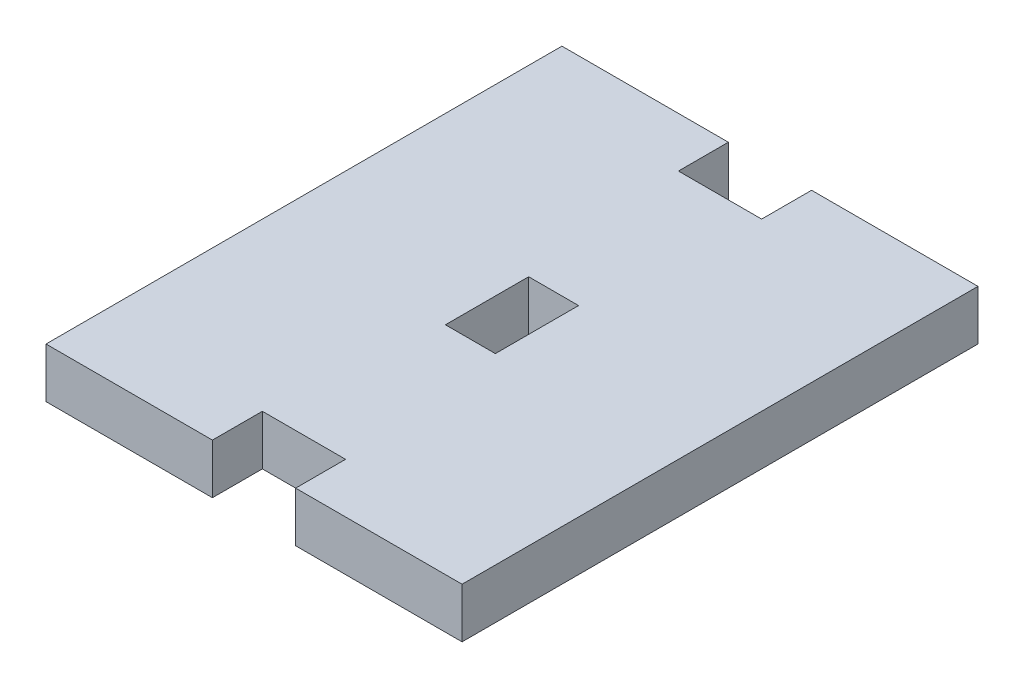
ISO-10303-21;
HEADER;
FILE_DESCRIPTION(('STEP AP214'),'2;1');
FILE_NAME('part.step','',(''),(''),'','','');
FILE_SCHEMA(('AUTOMOTIVE_DESIGN { 1 0 10303 214 1 1 1 1 }'));
ENDSEC;
DATA;
#1=APPLICATION_CONTEXT('core data for automotive mechanical design processes');
#2=APPLICATION_PROTOCOL_DEFINITION('international standard','automotive_design',2000,#1);
#3=PRODUCT_CONTEXT('',#1,'mechanical');
#4=PRODUCT('Part','Part','',(#3));
#5=PRODUCT_RELATED_PRODUCT_CATEGORY('part','',(#4));
#6=PRODUCT_DEFINITION_FORMATION('','',#4);
#7=PRODUCT_DEFINITION_CONTEXT('part definition',#1,'design');
#8=PRODUCT_DEFINITION('design','',#6,#7);
#9=PRODUCT_DEFINITION_SHAPE('','',#8);
#10=(LENGTH_UNIT() NAMED_UNIT(*) SI_UNIT(.MILLI.,.METRE.));
#11=(NAMED_UNIT(*) PLANE_ANGLE_UNIT() SI_UNIT($,.RADIAN.));
#12=(NAMED_UNIT(*) SI_UNIT($,.STERADIAN.) SOLID_ANGLE_UNIT());
#13=UNCERTAINTY_MEASURE_WITH_UNIT(LENGTH_MEASURE(1.E-05),#10,'distance_accuracy_value','');
#14=(GEOMETRIC_REPRESENTATION_CONTEXT(3) GLOBAL_UNCERTAINTY_ASSIGNED_CONTEXT((#13)) GLOBAL_UNIT_ASSIGNED_CONTEXT((#10,
#11,#12)) REPRESENTATION_CONTEXT('',''));
#15=CARTESIAN_POINT('',(0.,0.,0.));
#16=DIRECTION('',(0.,0.,1.));
#17=DIRECTION('',(1.,0.,0.));
#18=AXIS2_PLACEMENT_3D('',#15,#16,#17);
#19=CARTESIAN_POINT('',(25.,6.,-31.));
#20=DIRECTION('',(0.,0.,1.));
#21=DIRECTION('',(1.,0.,0.));
#22=AXIS2_PLACEMENT_3D('',#19,#20,#21);
#23=PLANE('',#22);
#24=DIRECTION('',(-1.,0.,0.));
#25=VECTOR('',#24,1.);
#26=CARTESIAN_POINT('',(25.,0.,-31.));
#27=LINE('',#26,#25);
#28=CARTESIAN_POINT('',(25.,0.,-31.));
#29=VERTEX_POINT('',#28);
#30=CARTESIAN_POINT('',(5.00000000000001,0.,-31.));
#31=VERTEX_POINT('',#30);
#32=EDGE_CURVE('E238',#29,#31,#27,.T.);
#33=ORIENTED_EDGE('',*,*,#32,.T.);
#34=DIRECTION('',(0.,-1.,0.));
#35=VECTOR('',#34,1.);
#36=CARTESIAN_POINT('',(5.00000000000001,6.,-31.));
#37=LINE('',#36,#35);
#38=CARTESIAN_POINT('',(5.00000000000001,6.,-31.));
#39=VERTEX_POINT('',#38);
#40=EDGE_CURVE('E180',#39,#31,#37,.T.);
#41=ORIENTED_EDGE('',*,*,#40,.F.);
#42=DIRECTION('',(-1.,0.,0.));
#43=VECTOR('',#42,1.);
#44=CARTESIAN_POINT('',(25.,6.,-31.));
#45=LINE('',#44,#43);
#46=CARTESIAN_POINT('',(25.,6.,-31.));
#47=VERTEX_POINT('',#46);
#48=EDGE_CURVE('E245',#47,#39,#45,.T.);
#49=ORIENTED_EDGE('',*,*,#48,.F.);
#50=DIRECTION('',(0.,-1.,0.));
#51=VECTOR('',#50,1.);
#52=CARTESIAN_POINT('',(25.,6.,-31.));
#53=LINE('',#52,#51);
#54=EDGE_CURVE('E262',#47,#29,#53,.T.);
#55=ORIENTED_EDGE('',*,*,#54,.T.);
#56=EDGE_LOOP('',(#33,#41,#49,#55));
#57=FACE_BOUND('',#56,.T.);
#58=ADVANCED_FACE('F34',(#57),#23,.F.);
#59=CARTESIAN_POINT('',(25.,6.,31.));
#60=DIRECTION('',(0.,0.,-1.));
#61=DIRECTION('',(-1.,0.,0.));
#62=AXIS2_PLACEMENT_3D('',#59,#60,#61);
#63=PLANE('',#62);
#64=DIRECTION('',(1.,0.,0.));
#65=VECTOR('',#64,1.);
#66=CARTESIAN_POINT('',(25.,0.,31.));
#67=LINE('',#66,#65);
#68=CARTESIAN_POINT('',(-25.,0.,31.));
#69=VERTEX_POINT('',#68);
#70=CARTESIAN_POINT('',(-4.99999999999999,0.,31.));
#71=VERTEX_POINT('',#70);
#72=EDGE_CURVE('E252',#69,#71,#67,.T.);
#73=ORIENTED_EDGE('',*,*,#72,.T.);
#74=DIRECTION('',(0.,-1.,0.));
#75=VECTOR('',#74,1.);
#76=CARTESIAN_POINT('',(-4.99999999999999,6.,31.));
#77=LINE('',#76,#75);
#78=CARTESIAN_POINT('',(-4.99999999999999,6.,31.));
#79=VERTEX_POINT('',#78);
#80=EDGE_CURVE('E201',#79,#71,#77,.T.);
#81=ORIENTED_EDGE('',*,*,#80,.F.);
#82=DIRECTION('',(1.,0.,0.));
#83=VECTOR('',#82,1.);
#84=CARTESIAN_POINT('',(25.,6.,31.));
#85=LINE('',#84,#83);
#86=CARTESIAN_POINT('',(-25.,6.,31.));
#87=VERTEX_POINT('',#86);
#88=EDGE_CURVE('E239',#87,#79,#85,.T.);
#89=ORIENTED_EDGE('',*,*,#88,.F.);
#90=DIRECTION('',(0.,-1.,0.));
#91=VECTOR('',#90,1.);
#92=CARTESIAN_POINT('',(-25.,6.,31.));
#93=LINE('',#92,#91);
#94=EDGE_CURVE('E11',#87,#69,#93,.T.);
#95=ORIENTED_EDGE('',*,*,#94,.T.);
#96=EDGE_LOOP('',(#73,#81,#89,#95));
#97=FACE_BOUND('',#96,.T.);
#98=ADVANCED_FACE('F299',(#97),#63,.F.);
#99=CARTESIAN_POINT('',(-25.,6.,31.));
#100=DIRECTION('',(1.,0.,0.));
#101=DIRECTION('',(0.,0.,-1.));
#102=AXIS2_PLACEMENT_3D('',#99,#100,#101);
#103=PLANE('',#102);
#104=DIRECTION('',(0.,0.,1.));
#105=VECTOR('',#104,1.);
#106=CARTESIAN_POINT('',(-25.,0.,31.));
#107=LINE('',#106,#105);
#108=CARTESIAN_POINT('',(-25.,0.,-31.));
#109=VERTEX_POINT('',#108);
#110=EDGE_CURVE('E226',#109,#69,#107,.T.);
#111=ORIENTED_EDGE('',*,*,#110,.T.);
#112=ORIENTED_EDGE('',*,*,#94,.F.);
#113=DIRECTION('',(0.,0.,1.));
#114=VECTOR('',#113,1.);
#115=CARTESIAN_POINT('',(-25.,6.,31.));
#116=LINE('',#115,#114);
#117=CARTESIAN_POINT('',(-25.,6.,-31.));
#118=VERTEX_POINT('',#117);
#119=EDGE_CURVE('E234',#118,#87,#116,.T.);
#120=ORIENTED_EDGE('',*,*,#119,.F.);
#121=DIRECTION('',(0.,-1.,0.));
#122=VECTOR('',#121,1.);
#123=CARTESIAN_POINT('',(-25.,6.,-31.));
#124=LINE('',#123,#122);
#125=EDGE_CURVE('E248',#118,#109,#124,.T.);
#126=ORIENTED_EDGE('',*,*,#125,.T.);
#127=EDGE_LOOP('',(#111,#112,#120,#126));
#128=FACE_BOUND('',#127,.T.);
#129=ADVANCED_FACE('F36',(#128),#103,.F.);
#130=CARTESIAN_POINT('',(5.00000000000001,6.,31.));
#131=VERTEX_POINT('',#130);
#132=CARTESIAN_POINT('',(25.,6.,31.));
#133=VERTEX_POINT('',#132);
#134=EDGE_CURVE('E237',#131,#133,#85,.T.);
#135=ORIENTED_EDGE('',*,*,#134,.F.);
#136=DIRECTION('',(0.,1.,0.));
#137=VECTOR('',#136,1.);
#138=CARTESIAN_POINT('',(5.00000000000001,6.,31.));
#139=LINE('',#138,#137);
#140=CARTESIAN_POINT('',(5.00000000000001,0.,31.));
#141=VERTEX_POINT('',#140);
#142=EDGE_CURVE('E212',#141,#131,#139,.T.);
#143=ORIENTED_EDGE('',*,*,#142,.F.);
#144=CARTESIAN_POINT('',(25.,0.,31.));
#145=VERTEX_POINT('',#144);
#146=EDGE_CURVE('E251',#141,#145,#67,.T.);
#147=ORIENTED_EDGE('',*,*,#146,.T.);
#148=DIRECTION('',(0.,-1.,0.));
#149=VECTOR('',#148,1.);
#150=CARTESIAN_POINT('',(25.,6.,31.));
#151=LINE('',#150,#149);
#152=EDGE_CURVE('E42',#133,#145,#151,.T.);
#153=ORIENTED_EDGE('',*,*,#152,.F.);
#154=EDGE_LOOP('',(#135,#143,#147,#153));
#155=FACE_BOUND('',#154,.T.);
#156=ADVANCED_FACE('F287',(#155),#63,.F.);
#157=CARTESIAN_POINT('',(25.,6.,31.));
#158=DIRECTION('',(-1.,0.,0.));
#159=DIRECTION('',(0.,0.,1.));
#160=AXIS2_PLACEMENT_3D('',#157,#158,#159);
#161=PLANE('',#160);
#162=DIRECTION('',(0.,0.,-1.));
#163=VECTOR('',#162,1.);
#164=CARTESIAN_POINT('',(25.,0.,31.));
#165=LINE('',#164,#163);
#166=EDGE_CURVE('E255',#145,#29,#165,.T.);
#167=ORIENTED_EDGE('',*,*,#166,.T.);
#168=ORIENTED_EDGE('',*,*,#54,.F.);
#169=DIRECTION('',(0.,0.,-1.));
#170=VECTOR('',#169,1.);
#171=CARTESIAN_POINT('',(25.,6.,31.));
#172=LINE('',#171,#170);
#173=EDGE_CURVE('E242',#133,#47,#172,.T.);
#174=ORIENTED_EDGE('',*,*,#173,.F.);
#175=ORIENTED_EDGE('',*,*,#152,.T.);
#176=EDGE_LOOP('',(#167,#168,#174,#175));
#177=FACE_BOUND('',#176,.T.);
#178=ADVANCED_FACE('F269',(#177),#161,.F.);
#179=CARTESIAN_POINT('',(-4.99999999999999,6.,-31.));
#180=VERTEX_POINT('',#179);
#181=EDGE_CURVE('E244',#180,#118,#45,.T.);
#182=ORIENTED_EDGE('',*,*,#181,.F.);
#183=DIRECTION('',(0.,1.,0.));
#184=VECTOR('',#183,1.);
#185=CARTESIAN_POINT('',(-4.99999999999999,6.,-31.));
#186=LINE('',#185,#184);
#187=CARTESIAN_POINT('',(-4.99999999999999,0.,-31.));
#188=VERTEX_POINT('',#187);
#189=EDGE_CURVE('E187',#188,#180,#186,.T.);
#190=ORIENTED_EDGE('',*,*,#189,.F.);
#191=EDGE_CURVE('E257',#188,#109,#27,.T.);
#192=ORIENTED_EDGE('',*,*,#191,.T.);
#193=ORIENTED_EDGE('',*,*,#125,.F.);
#194=EDGE_LOOP('',(#182,#190,#192,#193));
#195=FACE_BOUND('',#194,.T.);
#196=ADVANCED_FACE('F310',(#195),#23,.F.);
#197=CARTESIAN_POINT('',(0.,6.,0.));
#198=DIRECTION('',(0.,1.,0.));
#199=DIRECTION('',(0.,0.,1.));
#200=AXIS2_PLACEMENT_3D('',#197,#198,#199);
#201=PLANE('',#200);
#202=DIRECTION('',(0.,0.,1.));
#203=VECTOR('',#202,1.);
#204=CARTESIAN_POINT('',(-3.,6.,5.00000000000002));
#205=LINE('',#204,#203);
#206=CARTESIAN_POINT('',(-3.,6.,-4.99999999999999));
#207=VERTEX_POINT('',#206);
#208=CARTESIAN_POINT('',(-3.,6.,5.00000000000002));
#209=VERTEX_POINT('',#208);
#210=EDGE_CURVE('E49',#207,#209,#205,.T.);
#211=ORIENTED_EDGE('',*,*,#210,.F.);
#212=DIRECTION('',(-1.,0.,0.));
#213=VECTOR('',#212,1.);
#214=CARTESIAN_POINT('',(3.,6.,-4.99999999999999));
#215=LINE('',#214,#213);
#216=CARTESIAN_POINT('',(3.,6.,-4.99999999999999));
#217=VERTEX_POINT('',#216);
#218=EDGE_CURVE('E165',#217,#207,#215,.T.);
#219=ORIENTED_EDGE('',*,*,#218,.F.);
#220=DIRECTION('',(0.,0.,-1.));
#221=VECTOR('',#220,1.);
#222=CARTESIAN_POINT('',(3.,6.,5.00000000000002));
#223=LINE('',#222,#221);
#224=CARTESIAN_POINT('',(3.,6.,5.00000000000002));
#225=VERTEX_POINT('',#224);
#226=EDGE_CURVE('E168',#225,#217,#223,.T.);
#227=ORIENTED_EDGE('',*,*,#226,.F.);
#228=DIRECTION('',(1.,0.,0.));
#229=VECTOR('',#228,1.);
#230=CARTESIAN_POINT('',(3.,6.,5.00000000000002));
#231=LINE('',#230,#229);
#232=EDGE_CURVE('E174',#209,#225,#231,.T.);
#233=ORIENTED_EDGE('',*,*,#232,.F.);
#234=EDGE_LOOP('',(#211,#219,#227,#233));
#235=FACE_BOUND('',#234,.T.);
#236=DIRECTION('',(0.,0.,-1.));
#237=VECTOR('',#236,1.);
#238=CARTESIAN_POINT('',(5.00000000000001,6.,-25.));
#239=LINE('',#238,#237);
#240=CARTESIAN_POINT('',(5.00000000000001,6.,-25.));
#241=VERTEX_POINT('',#240);
#242=EDGE_CURVE('E199',#241,#39,#239,.T.);
#243=ORIENTED_EDGE('',*,*,#242,.F.);
#244=DIRECTION('',(1.,0.,0.));
#245=VECTOR('',#244,1.);
#246=CARTESIAN_POINT('',(5.00000000000001,6.,-25.));
#247=LINE('',#246,#245);
#248=CARTESIAN_POINT('',(-4.99999999999999,6.,-25.));
#249=VERTEX_POINT('',#248);
#250=EDGE_CURVE('E193',#249,#241,#247,.T.);
#251=ORIENTED_EDGE('',*,*,#250,.F.);
#252=DIRECTION('',(0.,0.,-1.));
#253=VECTOR('',#252,1.);
#254=CARTESIAN_POINT('',(-4.99999999999999,6.,-25.));
#255=LINE('',#254,#253);
#256=EDGE_CURVE('E202',#249,#180,#255,.T.);
#257=ORIENTED_EDGE('',*,*,#256,.T.);
#258=ORIENTED_EDGE('',*,*,#181,.T.);
#259=ORIENTED_EDGE('',*,*,#119,.T.);
#260=ORIENTED_EDGE('',*,*,#88,.T.);
#261=DIRECTION('',(0.,0.,1.));
#262=VECTOR('',#261,1.);
#263=CARTESIAN_POINT('',(-4.99999999999999,6.,25.));
#264=LINE('',#263,#262);
#265=CARTESIAN_POINT('',(-4.99999999999999,6.,25.));
#266=VERTEX_POINT('',#265);
#267=EDGE_CURVE('E224',#266,#79,#264,.T.);
#268=ORIENTED_EDGE('',*,*,#267,.F.);
#269=DIRECTION('',(-1.,0.,0.));
#270=VECTOR('',#269,1.);
#271=CARTESIAN_POINT('',(-4.99999999999999,6.,25.));
#272=LINE('',#271,#270);
#273=CARTESIAN_POINT('',(5.00000000000001,6.,25.));
#274=VERTEX_POINT('',#273);
#275=EDGE_CURVE('E218',#274,#266,#272,.T.);
#276=ORIENTED_EDGE('',*,*,#275,.F.);
#277=DIRECTION('',(0.,0.,1.));
#278=VECTOR('',#277,1.);
#279=CARTESIAN_POINT('',(5.00000000000001,6.,25.));
#280=LINE('',#279,#278);
#281=EDGE_CURVE('E227',#274,#131,#280,.T.);
#282=ORIENTED_EDGE('',*,*,#281,.T.);
#283=ORIENTED_EDGE('',*,*,#134,.T.);
#284=ORIENTED_EDGE('',*,*,#173,.T.);
#285=ORIENTED_EDGE('',*,*,#48,.T.);
#286=EDGE_LOOP('',(#243,#251,#257,#258,#259,#260,#268,#276,#282,#283,#284,#285));
#287=FACE_BOUND('',#286,.T.);
#288=ADVANCED_FACE('F283',(#235,#287),#201,.T.);
#289=CARTESIAN_POINT('',(0.,0.,0.));
#290=DIRECTION('',(0.,1.,0.));
#291=DIRECTION('',(0.,0.,1.));
#292=AXIS2_PLACEMENT_3D('',#289,#290,#291);
#293=PLANE('',#292);
#294=DIRECTION('',(-1.,0.,0.));
#295=VECTOR('',#294,1.);
#296=CARTESIAN_POINT('',(3.,0.,-4.99999999999999));
#297=LINE('',#296,#295);
#298=CARTESIAN_POINT('',(3.,0.,-4.99999999999999));
#299=VERTEX_POINT('',#298);
#300=CARTESIAN_POINT('',(-3.,0.,-4.99999999999999));
#301=VERTEX_POINT('',#300);
#302=EDGE_CURVE('E155',#299,#301,#297,.T.);
#303=ORIENTED_EDGE('',*,*,#302,.T.);
#304=DIRECTION('',(0.,0.,1.));
#305=VECTOR('',#304,1.);
#306=CARTESIAN_POINT('',(-3.,0.,5.00000000000002));
#307=LINE('',#306,#305);
#308=CARTESIAN_POINT('',(-3.,0.,5.00000000000002));
#309=VERTEX_POINT('',#308);
#310=EDGE_CURVE('E149',#301,#309,#307,.T.);
#311=ORIENTED_EDGE('',*,*,#310,.T.);
#312=DIRECTION('',(1.,0.,0.));
#313=VECTOR('',#312,1.);
#314=CARTESIAN_POINT('',(3.,0.,5.00000000000002));
#315=LINE('',#314,#313);
#316=CARTESIAN_POINT('',(3.,0.,5.00000000000002));
#317=VERTEX_POINT('',#316);
#318=EDGE_CURVE('E158',#309,#317,#315,.T.);
#319=ORIENTED_EDGE('',*,*,#318,.T.);
#320=DIRECTION('',(0.,0.,-1.));
#321=VECTOR('',#320,1.);
#322=CARTESIAN_POINT('',(3.,0.,5.00000000000002));
#323=LINE('',#322,#321);
#324=EDGE_CURVE('E57',#317,#299,#323,.T.);
#325=ORIENTED_EDGE('',*,*,#324,.T.);
#326=EDGE_LOOP('',(#303,#311,#319,#325));
#327=FACE_BOUND('',#326,.T.);
#328=DIRECTION('',(-1.,0.,0.));
#329=VECTOR('',#328,1.);
#330=CARTESIAN_POINT('',(5.00000000000001,0.,-25.));
#331=LINE('',#330,#329);
#332=CARTESIAN_POINT('',(5.00000000000001,0.,-25.));
#333=VERTEX_POINT('',#332);
#334=CARTESIAN_POINT('',(-4.99999999999999,0.,-25.));
#335=VERTEX_POINT('',#334);
#336=EDGE_CURVE('E186',#333,#335,#331,.T.);
#337=ORIENTED_EDGE('',*,*,#336,.F.);
#338=DIRECTION('',(0.,0.,-1.));
#339=VECTOR('',#338,1.);
#340=CARTESIAN_POINT('',(5.00000000000001,0.,-25.));
#341=LINE('',#340,#339);
#342=EDGE_CURVE('E196',#333,#31,#341,.T.);
#343=ORIENTED_EDGE('',*,*,#342,.T.);
#344=ORIENTED_EDGE('',*,*,#32,.F.);
#345=ORIENTED_EDGE('',*,*,#166,.F.);
#346=ORIENTED_EDGE('',*,*,#146,.F.);
#347=DIRECTION('',(0.,0.,1.));
#348=VECTOR('',#347,1.);
#349=CARTESIAN_POINT('',(5.00000000000001,0.,25.));
#350=LINE('',#349,#348);
#351=CARTESIAN_POINT('',(5.00000000000001,0.,25.));
#352=VERTEX_POINT('',#351);
#353=EDGE_CURVE('E230',#352,#141,#350,.T.);
#354=ORIENTED_EDGE('',*,*,#353,.F.);
#355=DIRECTION('',(1.,0.,0.));
#356=VECTOR('',#355,1.);
#357=CARTESIAN_POINT('',(-4.99999999999999,0.,25.));
#358=LINE('',#357,#356);
#359=CARTESIAN_POINT('',(-4.99999999999999,0.,25.));
#360=VERTEX_POINT('',#359);
#361=EDGE_CURVE('E211',#360,#352,#358,.T.);
#362=ORIENTED_EDGE('',*,*,#361,.F.);
#363=DIRECTION('',(0.,0.,1.));
#364=VECTOR('',#363,1.);
#365=CARTESIAN_POINT('',(-4.99999999999999,0.,25.));
#366=LINE('',#365,#364);
#367=EDGE_CURVE('E221',#360,#71,#366,.T.);
#368=ORIENTED_EDGE('',*,*,#367,.T.);
#369=ORIENTED_EDGE('',*,*,#72,.F.);
#370=ORIENTED_EDGE('',*,*,#110,.F.);
#371=ORIENTED_EDGE('',*,*,#191,.F.);
#372=DIRECTION('',(0.,0.,-1.));
#373=VECTOR('',#372,1.);
#374=CARTESIAN_POINT('',(-4.99999999999999,0.,-25.));
#375=LINE('',#374,#373);
#376=EDGE_CURVE('E205',#335,#188,#375,.T.);
#377=ORIENTED_EDGE('',*,*,#376,.F.);
#378=EDGE_LOOP('',(#337,#343,#344,#345,#346,#354,#362,#368,#369,#370,#371,#377));
#379=FACE_BOUND('',#378,.T.);
#380=ADVANCED_FACE('F162',(#327,#379),#293,.F.);
#381=CARTESIAN_POINT('',(-4.99999999999999,6.,25.));
#382=DIRECTION('',(-1.,0.,0.));
#383=DIRECTION('',(0.,-1.,0.));
#384=AXIS2_PLACEMENT_3D('',#381,#382,#383);
#385=PLANE('',#384);
#386=ORIENTED_EDGE('',*,*,#80,.T.);
#387=ORIENTED_EDGE('',*,*,#367,.F.);
#388=DIRECTION('',(0.,-1.,0.));
#389=VECTOR('',#388,1.);
#390=CARTESIAN_POINT('',(-4.99999999999999,6.,25.));
#391=LINE('',#390,#389);
#392=EDGE_CURVE('E209',#266,#360,#391,.T.);
#393=ORIENTED_EDGE('',*,*,#392,.F.);
#394=ORIENTED_EDGE('',*,*,#267,.T.);
#395=EDGE_LOOP('',(#386,#387,#393,#394));
#396=FACE_BOUND('',#395,.T.);
#397=ADVANCED_FACE('F296',(#396),#385,.F.);
#398=CARTESIAN_POINT('',(5.00000000000001,6.,25.));
#399=DIRECTION('',(1.,0.,0.));
#400=DIRECTION('',(0.,0.,-1.));
#401=AXIS2_PLACEMENT_3D('',#398,#399,#400);
#402=PLANE('',#401);
#403=ORIENTED_EDGE('',*,*,#142,.T.);
#404=ORIENTED_EDGE('',*,*,#281,.F.);
#405=DIRECTION('',(0.,1.,0.));
#406=VECTOR('',#405,1.);
#407=CARTESIAN_POINT('',(5.00000000000001,6.,25.));
#408=LINE('',#407,#406);
#409=EDGE_CURVE('E215',#352,#274,#408,.T.);
#410=ORIENTED_EDGE('',*,*,#409,.F.);
#411=ORIENTED_EDGE('',*,*,#353,.T.);
#412=EDGE_LOOP('',(#403,#404,#410,#411));
#413=FACE_BOUND('',#412,.T.);
#414=ADVANCED_FACE('F289',(#413),#402,.F.);
#415=CARTESIAN_POINT('',(0.,0.,25.));
#416=DIRECTION('',(0.,0.,1.));
#417=DIRECTION('',(1.,0.,0.));
#418=AXIS2_PLACEMENT_3D('',#415,#416,#417);
#419=PLANE('',#418);
#420=ORIENTED_EDGE('',*,*,#392,.T.);
#421=ORIENTED_EDGE('',*,*,#361,.T.);
#422=ORIENTED_EDGE('',*,*,#409,.T.);
#423=ORIENTED_EDGE('',*,*,#275,.T.);
#424=EDGE_LOOP('',(#420,#421,#422,#423));
#425=FACE_BOUND('',#424,.T.);
#426=ADVANCED_FACE('F293',(#425),#419,.T.);
#427=CARTESIAN_POINT('',(5.00000000000001,6.,-25.));
#428=DIRECTION('',(1.,0.,0.));
#429=DIRECTION('',(0.,1.,0.));
#430=AXIS2_PLACEMENT_3D('',#427,#428,#429);
#431=PLANE('',#430);
#432=ORIENTED_EDGE('',*,*,#40,.T.);
#433=ORIENTED_EDGE('',*,*,#342,.F.);
#434=DIRECTION('',(0.,-1.,0.));
#435=VECTOR('',#434,1.);
#436=CARTESIAN_POINT('',(5.00000000000001,6.,-25.));
#437=LINE('',#436,#435);
#438=EDGE_CURVE('E184',#241,#333,#437,.T.);
#439=ORIENTED_EDGE('',*,*,#438,.F.);
#440=ORIENTED_EDGE('',*,*,#242,.T.);
#441=EDGE_LOOP('',(#432,#433,#439,#440));
#442=FACE_BOUND('',#441,.T.);
#443=ADVANCED_FACE('F316',(#442),#431,.F.);
#444=CARTESIAN_POINT('',(-4.99999999999999,6.,-25.));
#445=DIRECTION('',(-1.,0.,0.));
#446=DIRECTION('',(0.,0.,1.));
#447=AXIS2_PLACEMENT_3D('',#444,#445,#446);
#448=PLANE('',#447);
#449=ORIENTED_EDGE('',*,*,#189,.T.);
#450=ORIENTED_EDGE('',*,*,#256,.F.);
#451=DIRECTION('',(0.,1.,0.));
#452=VECTOR('',#451,1.);
#453=CARTESIAN_POINT('',(-4.99999999999999,6.,-25.));
#454=LINE('',#453,#452);
#455=EDGE_CURVE('E190',#335,#249,#454,.T.);
#456=ORIENTED_EDGE('',*,*,#455,.F.);
#457=ORIENTED_EDGE('',*,*,#376,.T.);
#458=EDGE_LOOP('',(#449,#450,#456,#457));
#459=FACE_BOUND('',#458,.T.);
#460=ADVANCED_FACE('F312',(#459),#448,.F.);
#461=CARTESIAN_POINT('',(0.,0.,-25.));
#462=DIRECTION('',(0.,0.,-1.));
#463=DIRECTION('',(-1.,0.,0.));
#464=AXIS2_PLACEMENT_3D('',#461,#462,#463);
#465=PLANE('',#464);
#466=ORIENTED_EDGE('',*,*,#438,.T.);
#467=ORIENTED_EDGE('',*,*,#336,.T.);
#468=ORIENTED_EDGE('',*,*,#455,.T.);
#469=ORIENTED_EDGE('',*,*,#250,.T.);
#470=EDGE_LOOP('',(#466,#467,#468,#469));
#471=FACE_BOUND('',#470,.T.);
#472=ADVANCED_FACE('F314',(#471),#465,.T.);
#473=CARTESIAN_POINT('',(-3.,0.,5.00000000000002));
#474=DIRECTION('',(-1.,0.,0.));
#475=DIRECTION('',(0.,0.,1.));
#476=AXIS2_PLACEMENT_3D('',#473,#474,#475);
#477=PLANE('',#476);
#478=ORIENTED_EDGE('',*,*,#210,.T.);
#479=DIRECTION('',(0.,1.,0.));
#480=VECTOR('',#479,1.);
#481=CARTESIAN_POINT('',(-3.,0.,5.00000000000002));
#482=LINE('',#481,#480);
#483=EDGE_CURVE('E145',#309,#209,#482,.T.);
#484=ORIENTED_EDGE('',*,*,#483,.F.);
#485=ORIENTED_EDGE('',*,*,#310,.F.);
#486=DIRECTION('',(0.,1.,0.));
#487=VECTOR('',#486,1.);
#488=CARTESIAN_POINT('',(-3.,0.,-4.99999999999999));
#489=LINE('',#488,#487);
#490=EDGE_CURVE('E178',#301,#207,#489,.T.);
#491=ORIENTED_EDGE('',*,*,#490,.T.);
#492=EDGE_LOOP('',(#478,#484,#485,#491));
#493=FACE_BOUND('',#492,.T.);
#494=ADVANCED_FACE('F147',(#493),#477,.F.);
#495=CARTESIAN_POINT('',(3.,0.,-4.99999999999999));
#496=DIRECTION('',(0.,0.,-1.));
#497=DIRECTION('',(-1.,0.,0.));
#498=AXIS2_PLACEMENT_3D('',#495,#496,#497);
#499=PLANE('',#498);
#500=ORIENTED_EDGE('',*,*,#218,.T.);
#501=ORIENTED_EDGE('',*,*,#490,.F.);
#502=ORIENTED_EDGE('',*,*,#302,.F.);
#503=DIRECTION('',(0.,1.,0.));
#504=VECTOR('',#503,1.);
#505=CARTESIAN_POINT('',(3.,0.,-4.99999999999999));
#506=LINE('',#505,#504);
#507=EDGE_CURVE('E181',#299,#217,#506,.T.);
#508=ORIENTED_EDGE('',*,*,#507,.T.);
#509=EDGE_LOOP('',(#500,#501,#502,#508));
#510=FACE_BOUND('',#509,.T.);
#511=ADVANCED_FACE('F427',(#510),#499,.F.);
#512=CARTESIAN_POINT('',(3.,0.,5.00000000000002));
#513=DIRECTION('',(1.,0.,0.));
#514=DIRECTION('',(0.,0.,-1.));
#515=AXIS2_PLACEMENT_3D('',#512,#513,#514);
#516=PLANE('',#515);
#517=ORIENTED_EDGE('',*,*,#226,.T.);
#518=ORIENTED_EDGE('',*,*,#507,.F.);
#519=ORIENTED_EDGE('',*,*,#324,.F.);
#520=DIRECTION('',(0.,1.,0.));
#521=VECTOR('',#520,1.);
#522=CARTESIAN_POINT('',(3.,0.,5.00000000000002));
#523=LINE('',#522,#521);
#524=EDGE_CURVE('E154',#317,#225,#523,.T.);
#525=ORIENTED_EDGE('',*,*,#524,.T.);
#526=EDGE_LOOP('',(#517,#518,#519,#525));
#527=FACE_BOUND('',#526,.T.);
#528=ADVANCED_FACE('F436',(#527),#516,.F.);
#529=CARTESIAN_POINT('',(3.,0.,5.00000000000002));
#530=DIRECTION('',(0.,0.,1.));
#531=DIRECTION('',(1.,0.,0.));
#532=AXIS2_PLACEMENT_3D('',#529,#530,#531);
#533=PLANE('',#532);
#534=ORIENTED_EDGE('',*,*,#232,.T.);
#535=ORIENTED_EDGE('',*,*,#524,.F.);
#536=ORIENTED_EDGE('',*,*,#318,.F.);
#537=ORIENTED_EDGE('',*,*,#483,.T.);
#538=EDGE_LOOP('',(#534,#535,#536,#537));
#539=FACE_BOUND('',#538,.T.);
#540=ADVANCED_FACE('F159',(#539),#533,.F.);
#541=CLOSED_SHELL('',(#58,#98,#129,#156,#178,#196,#288,#380,#397,#414,#426,#443,#460,#472,#494,
#511,#528,#540));
#542=MANIFOLD_SOLID_BREP('B2',#541);
#543=ADVANCED_BREP_SHAPE_REPRESENTATION('',(#18,#542),#14);
#544=SHAPE_DEFINITION_REPRESENTATION(#9,#543);
ENDSEC;
END-ISO-10303-21;
